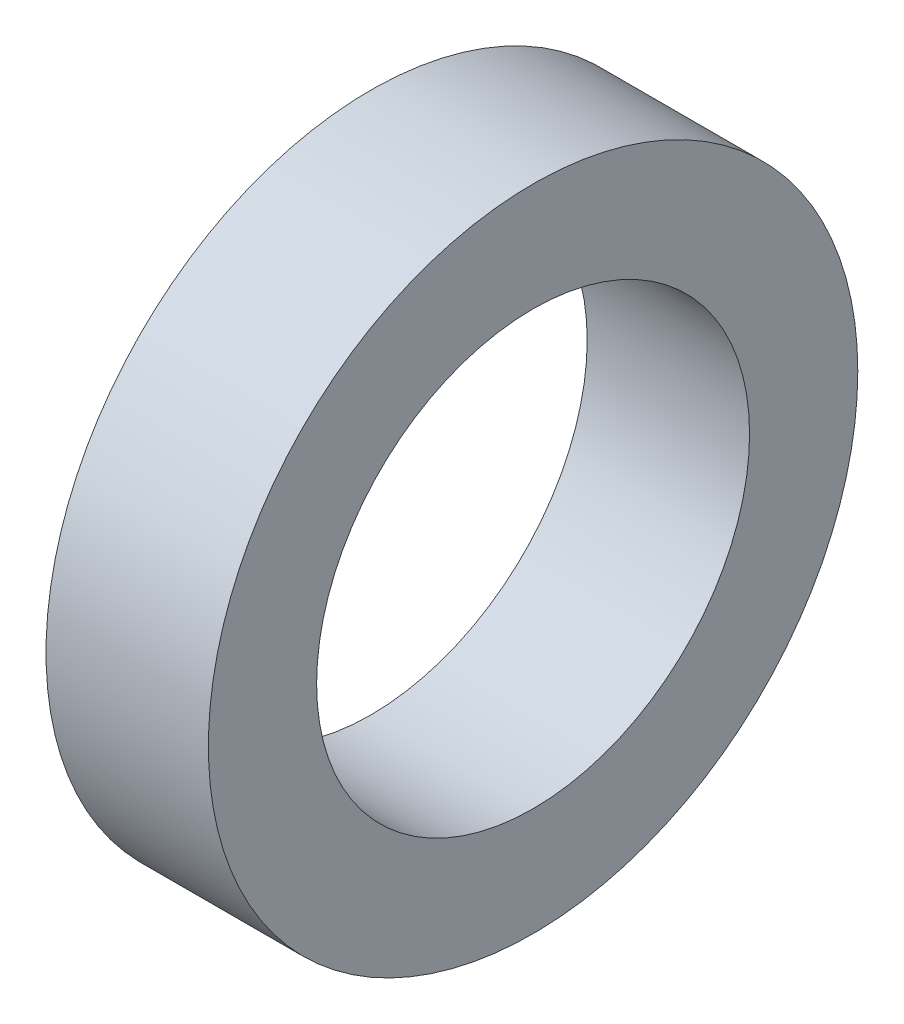
ISO-10303-21;
HEADER;
FILE_DESCRIPTION(('STEP AP214'),'2;1');
FILE_NAME('part.step','',(''),(''),'','','');
FILE_SCHEMA(('AUTOMOTIVE_DESIGN { 1 0 10303 214 1 1 1 1 }'));
ENDSEC;
DATA;
#1=APPLICATION_CONTEXT('core data for automotive mechanical design processes');
#2=APPLICATION_PROTOCOL_DEFINITION('international standard','automotive_design',2000,#1);
#3=PRODUCT_CONTEXT('',#1,'mechanical');
#4=PRODUCT('Part','Part','',(#3));
#5=PRODUCT_RELATED_PRODUCT_CATEGORY('part','',(#4));
#6=PRODUCT_DEFINITION_FORMATION('','',#4);
#7=PRODUCT_DEFINITION_CONTEXT('part definition',#1,'design');
#8=PRODUCT_DEFINITION('design','',#6,#7);
#9=PRODUCT_DEFINITION_SHAPE('','',#8);
#10=(LENGTH_UNIT() NAMED_UNIT(*) SI_UNIT(.MILLI.,.METRE.));
#11=(NAMED_UNIT(*) PLANE_ANGLE_UNIT() SI_UNIT($,.RADIAN.));
#12=(NAMED_UNIT(*) SI_UNIT($,.STERADIAN.) SOLID_ANGLE_UNIT());
#13=UNCERTAINTY_MEASURE_WITH_UNIT(LENGTH_MEASURE(1.E-05),#10,'distance_accuracy_value','');
#14=(GEOMETRIC_REPRESENTATION_CONTEXT(3) GLOBAL_UNCERTAINTY_ASSIGNED_CONTEXT((#13)) GLOBAL_UNIT_ASSIGNED_CONTEXT((#10,
#11,#12)) REPRESENTATION_CONTEXT('',''));
#15=CARTESIAN_POINT('',(0.,0.,0.));
#16=DIRECTION('',(0.,0.,1.));
#17=DIRECTION('',(1.,0.,0.));
#18=AXIS2_PLACEMENT_3D('',#15,#16,#17);
#19=CARTESIAN_POINT('',(3.,0.,0.));
#20=DIRECTION('',(1.,0.,0.));
#21=DIRECTION('',(0.,0.,-1.));
#22=AXIS2_PLACEMENT_3D('',#19,#20,#21);
#23=PLANE('',#22);
#24=CARTESIAN_POINT('',(3.,0.,0.));
#25=DIRECTION('',(1.,0.,0.));
#26=DIRECTION('',(0.,0.,-1.));
#27=AXIS2_PLACEMENT_3D('',#24,#25,#26);
#28=CIRCLE('',#27,6.);
#29=CARTESIAN_POINT('',(3.,0.,-6.));
#30=VERTEX_POINT('',#29);
#31=EDGE_CURVE('E10',#30,#30,#28,.T.);
#32=ORIENTED_EDGE('',*,*,#31,.T.);
#33=EDGE_LOOP('',(#32));
#34=FACE_BOUND('',#33,.T.);
#35=CARTESIAN_POINT('',(3.,0.,0.));
#36=DIRECTION('',(1.,0.,0.));
#37=DIRECTION('',(0.,0.,-1.));
#38=AXIS2_PLACEMENT_3D('',#35,#36,#37);
#39=CIRCLE('',#38,4.);
#40=CARTESIAN_POINT('',(3.,0.,-4.));
#41=VERTEX_POINT('',#40);
#42=EDGE_CURVE('E50',#41,#41,#39,.T.);
#43=ORIENTED_EDGE('',*,*,#42,.F.);
#44=EDGE_LOOP('',(#43));
#45=FACE_BOUND('',#44,.T.);
#46=ADVANCED_FACE('F37',(#34,#45),#23,.T.);
#47=CARTESIAN_POINT('',(0.,0.,0.));
#48=DIRECTION('',(1.,0.,0.));
#49=DIRECTION('',(0.,0.,-1.));
#50=AXIS2_PLACEMENT_3D('',#47,#48,#49);
#51=PLANE('',#50);
#52=CARTESIAN_POINT('',(0.,0.,0.));
#53=DIRECTION('',(1.,0.,0.));
#54=DIRECTION('',(0.,0.,-1.));
#55=AXIS2_PLACEMENT_3D('',#52,#53,#54);
#56=CIRCLE('',#55,6.);
#57=CARTESIAN_POINT('',(0.,0.,-6.));
#58=VERTEX_POINT('',#57);
#59=EDGE_CURVE('E41',#58,#58,#56,.T.);
#60=ORIENTED_EDGE('',*,*,#59,.F.);
#61=EDGE_LOOP('',(#60));
#62=FACE_BOUND('',#61,.T.);
#63=CARTESIAN_POINT('',(0.,0.,0.));
#64=DIRECTION('',(1.,0.,0.));
#65=DIRECTION('',(0.,0.,-1.));
#66=AXIS2_PLACEMENT_3D('',#63,#64,#65);
#67=CIRCLE('',#66,4.);
#68=CARTESIAN_POINT('',(0.,0.,-4.));
#69=VERTEX_POINT('',#68);
#70=EDGE_CURVE('E52',#69,#69,#67,.T.);
#71=ORIENTED_EDGE('',*,*,#70,.T.);
#72=EDGE_LOOP('',(#71));
#73=FACE_BOUND('',#72,.T.);
#74=ADVANCED_FACE('F64',(#62,#73),#51,.F.);
#75=CARTESIAN_POINT('',(3.,0.,0.));
#76=DIRECTION('',(-1.,0.,0.));
#77=DIRECTION('',(0.,0.,1.));
#78=AXIS2_PLACEMENT_3D('',#75,#76,#77);
#79=CYLINDRICAL_SURFACE('',#78,6.);
#80=ORIENTED_EDGE('',*,*,#31,.F.);
#81=EDGE_LOOP('',(#80));
#82=FACE_BOUND('',#81,.T.);
#83=ORIENTED_EDGE('',*,*,#59,.T.);
#84=EDGE_LOOP('',(#83));
#85=FACE_BOUND('',#84,.T.);
#86=ADVANCED_FACE('F39',(#82,#85),#79,.T.);
#87=CARTESIAN_POINT('',(3.,0.,0.));
#88=DIRECTION('',(-1.,0.,0.));
#89=DIRECTION('',(0.,0.,1.));
#90=AXIS2_PLACEMENT_3D('',#87,#88,#89);
#91=CYLINDRICAL_SURFACE('',#90,4.);
#92=ORIENTED_EDGE('',*,*,#42,.T.);
#93=EDGE_LOOP('',(#92));
#94=FACE_BOUND('',#93,.T.);
#95=ORIENTED_EDGE('',*,*,#70,.F.);
#96=EDGE_LOOP('',(#95));
#97=FACE_BOUND('',#96,.T.);
#98=ADVANCED_FACE('F60',(#94,#97),#91,.F.);
#99=CLOSED_SHELL('',(#46,#74,#86,#98));
#100=MANIFOLD_SOLID_BREP('B2',#99);
#101=ADVANCED_BREP_SHAPE_REPRESENTATION('',(#18,#100),#14);
#102=SHAPE_DEFINITION_REPRESENTATION(#9,#101);
ENDSEC;
END-ISO-10303-21;
